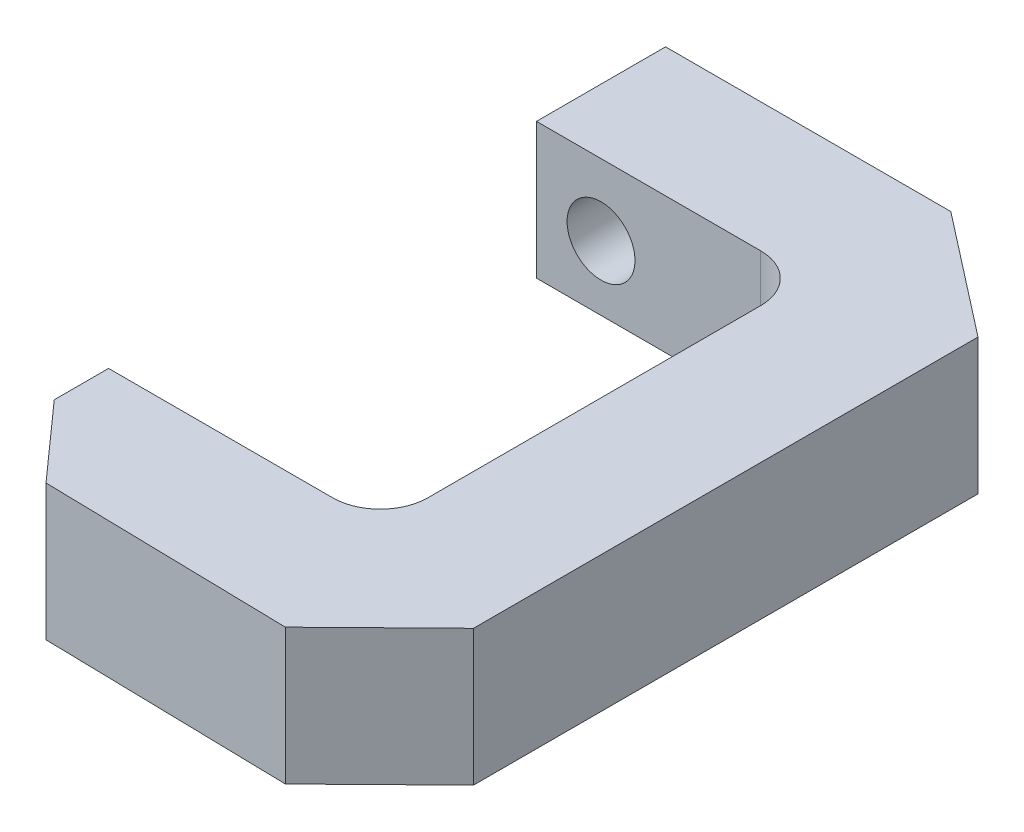
ISO-10303-21;
HEADER;
FILE_DESCRIPTION(('STEP AP214'),'2;1');
FILE_NAME('part.step','',(''),(''),'','','');
FILE_SCHEMA(('AUTOMOTIVE_DESIGN { 1 0 10303 214 1 1 1 1 }'));
ENDSEC;
DATA;
#1=APPLICATION_CONTEXT('core data for automotive mechanical design processes');
#2=APPLICATION_PROTOCOL_DEFINITION('international standard','automotive_design',2000,#1);
#3=PRODUCT_CONTEXT('',#1,'mechanical');
#4=PRODUCT('Part','Part','',(#3));
#5=PRODUCT_RELATED_PRODUCT_CATEGORY('part','',(#4));
#6=PRODUCT_DEFINITION_FORMATION('','',#4);
#7=PRODUCT_DEFINITION_CONTEXT('part definition',#1,'design');
#8=PRODUCT_DEFINITION('design','',#6,#7);
#9=PRODUCT_DEFINITION_SHAPE('','',#8);
#10=(LENGTH_UNIT() NAMED_UNIT(*) SI_UNIT(.MILLI.,.METRE.));
#11=(NAMED_UNIT(*) PLANE_ANGLE_UNIT() SI_UNIT($,.RADIAN.));
#12=(NAMED_UNIT(*) SI_UNIT($,.STERADIAN.) SOLID_ANGLE_UNIT());
#13=UNCERTAINTY_MEASURE_WITH_UNIT(LENGTH_MEASURE(1.E-05),#10,'distance_accuracy_value','');
#14=(GEOMETRIC_REPRESENTATION_CONTEXT(3) GLOBAL_UNCERTAINTY_ASSIGNED_CONTEXT((#13)) GLOBAL_UNIT_ASSIGNED_CONTEXT((#10,
#11,#12)) REPRESENTATION_CONTEXT('',''));
#15=CARTESIAN_POINT('',(0.,0.,0.));
#16=DIRECTION('',(0.,0.,1.));
#17=DIRECTION('',(1.,0.,0.));
#18=AXIS2_PLACEMENT_3D('',#15,#16,#17);
#19=CARTESIAN_POINT('',(33.,0.,-26.));
#20=DIRECTION('',(0.,-1.,0.));
#21=DIRECTION('',(0.,0.,-1.));
#22=AXIS2_PLACEMENT_3D('',#19,#20,#21);
#23=CYLINDRICAL_SURFACE('',#22,7.);
#24=DIRECTION('',(0.,1.,0.));
#25=VECTOR('',#24,1.);
#26=CARTESIAN_POINT('',(40.,0.,-26.));
#27=LINE('',#26,#25);
#28=CARTESIAN_POINT('',(40.,0.,-26.));
#29=VERTEX_POINT('',#28);
#30=CARTESIAN_POINT('',(40.,20.,-26.));
#31=VERTEX_POINT('',#30);
#32=EDGE_CURVE('E181',#29,#31,#27,.T.);
#33=ORIENTED_EDGE('',*,*,#32,.F.);
#34=CARTESIAN_POINT('',(33.,0.,-26.));
#35=DIRECTION('',(0.,-1.,0.));
#36=DIRECTION('',(0.,0.,-1.));
#37=AXIS2_PLACEMENT_3D('',#34,#35,#36);
#38=CIRCLE('',#37,7.);
#39=CARTESIAN_POINT('',(33.,0.,-19.));
#40=VERTEX_POINT('',#39);
#41=EDGE_CURVE('E44',#29,#40,#38,.T.);
#42=ORIENTED_EDGE('',*,*,#41,.T.);
#43=DIRECTION('',(0.,1.,0.));
#44=VECTOR('',#43,1.);
#45=CARTESIAN_POINT('',(33.,0.,-19.));
#46=LINE('',#45,#44);
#47=CARTESIAN_POINT('',(33.,20.,-19.));
#48=VERTEX_POINT('',#47);
#49=EDGE_CURVE('E133',#48,#40,#46,.F.);
#50=ORIENTED_EDGE('',*,*,#49,.F.);
#51=CARTESIAN_POINT('',(33.,20.,-26.));
#52=DIRECTION('',(0.,-1.,0.));
#53=DIRECTION('',(0.,0.,-1.));
#54=AXIS2_PLACEMENT_3D('',#51,#52,#53);
#55=CIRCLE('',#54,7.);
#56=EDGE_CURVE('E11',#48,#31,#55,.F.);
#57=ORIENTED_EDGE('',*,*,#56,.T.);
#58=EDGE_LOOP('',(#33,#42,#50,#57));
#59=FACE_BOUND('',#58,.T.);
#60=ADVANCED_FACE('F37',(#59),#23,.F.);
#61=CARTESIAN_POINT('',(33.,0.,-75.));
#62=DIRECTION('',(0.,-1.,0.));
#63=DIRECTION('',(0.,0.,-1.));
#64=AXIS2_PLACEMENT_3D('',#61,#62,#63);
#65=CYLINDRICAL_SURFACE('',#64,7.);
#66=DIRECTION('',(0.,1.,0.));
#67=VECTOR('',#66,1.);
#68=CARTESIAN_POINT('',(33.,0.,-82.));
#69=LINE('',#68,#67);
#70=CARTESIAN_POINT('',(33.,0.,-82.));
#71=VERTEX_POINT('',#70);
#72=CARTESIAN_POINT('',(33.,20.,-82.));
#73=VERTEX_POINT('',#72);
#74=EDGE_CURVE('E164',#71,#73,#69,.T.);
#75=ORIENTED_EDGE('',*,*,#74,.F.);
#76=CARTESIAN_POINT('',(33.,0.,-75.));
#77=DIRECTION('',(0.,-1.,0.));
#78=DIRECTION('',(0.,0.,-1.));
#79=AXIS2_PLACEMENT_3D('',#76,#77,#78);
#80=CIRCLE('',#79,7.);
#81=CARTESIAN_POINT('',(40.,0.,-75.));
#82=VERTEX_POINT('',#81);
#83=EDGE_CURVE('E176',#71,#82,#80,.T.);
#84=ORIENTED_EDGE('',*,*,#83,.T.);
#85=DIRECTION('',(0.,1.,0.));
#86=VECTOR('',#85,1.);
#87=CARTESIAN_POINT('',(40.,0.,-75.));
#88=LINE('',#87,#86);
#89=CARTESIAN_POINT('',(40.,20.,-75.));
#90=VERTEX_POINT('',#89);
#91=EDGE_CURVE('E173',#90,#82,#88,.F.);
#92=ORIENTED_EDGE('',*,*,#91,.F.);
#93=CARTESIAN_POINT('',(33.,20.,-75.));
#94=DIRECTION('',(0.,-1.,0.));
#95=DIRECTION('',(0.,0.,-1.));
#96=AXIS2_PLACEMENT_3D('',#93,#94,#95);
#97=CIRCLE('',#96,7.);
#98=EDGE_CURVE('E179',#90,#73,#97,.F.);
#99=ORIENTED_EDGE('',*,*,#98,.T.);
#100=EDGE_LOOP('',(#75,#84,#92,#99));
#101=FACE_BOUND('',#100,.T.);
#102=ADVANCED_FACE('F282',(#101),#65,.F.);
#103=CARTESIAN_POINT('',(0.,20.,0.));
#104=DIRECTION('',(1.,0.,0.));
#105=DIRECTION('',(0.,0.,-1.));
#106=AXIS2_PLACEMENT_3D('',#103,#104,#105);
#107=PLANE('',#106);
#108=DIRECTION('',(0.,0.,1.));
#109=VECTOR('',#108,1.);
#110=CARTESIAN_POINT('',(0.,0.,0.));
#111=LINE('',#110,#109);
#112=CARTESIAN_POINT('',(0.,0.,-101.));
#113=VERTEX_POINT('',#112);
#114=CARTESIAN_POINT('',(0.,0.,-82.));
#115=VERTEX_POINT('',#114);
#116=EDGE_CURVE('E152',#113,#115,#111,.T.);
#117=ORIENTED_EDGE('',*,*,#116,.T.);
#118=DIRECTION('',(0.,1.,0.));
#119=VECTOR('',#118,1.);
#120=CARTESIAN_POINT('',(0.,0.,-82.));
#121=LINE('',#120,#119);
#122=CARTESIAN_POINT('',(0.,20.,-82.));
#123=VERTEX_POINT('',#122);
#124=EDGE_CURVE('E146',#115,#123,#121,.T.);
#125=ORIENTED_EDGE('',*,*,#124,.T.);
#126=DIRECTION('',(0.,0.,1.));
#127=VECTOR('',#126,1.);
#128=CARTESIAN_POINT('',(0.,20.,0.));
#129=LINE('',#128,#127);
#130=CARTESIAN_POINT('',(0.,20.,-101.));
#131=VERTEX_POINT('',#130);
#132=EDGE_CURVE('E165',#131,#123,#129,.T.);
#133=ORIENTED_EDGE('',*,*,#132,.F.);
#134=DIRECTION('',(0.,-1.,0.));
#135=VECTOR('',#134,1.);
#136=CARTESIAN_POINT('',(0.,20.,-101.));
#137=LINE('',#136,#135);
#138=EDGE_CURVE('E161',#131,#113,#137,.T.);
#139=ORIENTED_EDGE('',*,*,#138,.T.);
#140=EDGE_LOOP('',(#117,#125,#133,#139));
#141=FACE_BOUND('',#140,.T.);
#142=ADVANCED_FACE('F260',(#141),#107,.F.);
#143=CARTESIAN_POINT('',(60.,20.,1.27599611273081));
#144=DIRECTION('',(0.0212617944039578,0.,-0.999773942498365));
#145=DIRECTION('',(-0.999773942498365,0.,-0.0212617944039578));
#146=AXIS2_PLACEMENT_3D('',#143,#144,#145);
#147=PLANE('',#146);
#148=DIRECTION('',(0.999773942498365,0.,0.0212617944039578));
#149=VECTOR('',#148,1.);
#150=CARTESIAN_POINT('',(60.,0.,1.27599611273081));
#151=LINE('',#150,#149);
#152=CARTESIAN_POINT('',(10.,0.,0.212666018788469));
#153=VERTEX_POINT('',#152);
#154=CARTESIAN_POINT('',(46.,0.,0.978263686426952));
#155=VERTEX_POINT('',#154);
#156=EDGE_CURVE('E231',#153,#155,#151,.T.);
#157=ORIENTED_EDGE('',*,*,#156,.T.);
#158=DIRECTION('',(0.,1.,0.));
#159=VECTOR('',#158,1.);
#160=CARTESIAN_POINT('',(46.,0.,0.978263686426953));
#161=LINE('',#160,#159);
#162=CARTESIAN_POINT('',(46.,20.,0.978263686426953));
#163=VERTEX_POINT('',#162);
#164=EDGE_CURVE('E211',#155,#163,#161,.T.);
#165=ORIENTED_EDGE('',*,*,#164,.T.);
#166=DIRECTION('',(0.999773942498365,0.,0.0212617944039578));
#167=VECTOR('',#166,1.);
#168=CARTESIAN_POINT('',(60.,20.,1.27599611273081));
#169=LINE('',#168,#167);
#170=CARTESIAN_POINT('',(10.,20.,0.212666018788469));
#171=VERTEX_POINT('',#170);
#172=EDGE_CURVE('E156',#171,#163,#169,.T.);
#173=ORIENTED_EDGE('',*,*,#172,.F.);
#174=DIRECTION('',(0.,1.,0.));
#175=VECTOR('',#174,1.);
#176=CARTESIAN_POINT('',(10.,0.,0.212666018788469));
#177=LINE('',#176,#175);
#178=EDGE_CURVE('E210',#153,#171,#177,.T.);
#179=ORIENTED_EDGE('',*,*,#178,.F.);
#180=EDGE_LOOP('',(#157,#165,#173,#179));
#181=FACE_BOUND('',#180,.T.);
#182=ADVANCED_FACE('F268',(#181),#147,.F.);
#183=CARTESIAN_POINT('',(60.,20.,-101.));
#184=DIRECTION('',(-1.,0.,0.));
#185=DIRECTION('',(0.,0.,1.));
#186=AXIS2_PLACEMENT_3D('',#183,#184,#185);
#187=PLANE('',#186);
#188=DIRECTION('',(0.,0.,-1.));
#189=VECTOR('',#188,1.);
#190=CARTESIAN_POINT('',(60.,20.,-101.));
#191=LINE('',#190,#189);
#192=CARTESIAN_POINT('',(60.,20.,-12.7240038872692));
#193=VERTEX_POINT('',#192);
#194=CARTESIAN_POINT('',(60.,20.,-87.));
#195=VERTEX_POINT('',#194);
#196=EDGE_CURVE('E235',#193,#195,#191,.T.);
#197=ORIENTED_EDGE('',*,*,#196,.F.);
#198=DIRECTION('',(0.,1.,0.));
#199=VECTOR('',#198,1.);
#200=CARTESIAN_POINT('',(60.,0.,-12.7240038872692));
#201=LINE('',#200,#199);
#202=CARTESIAN_POINT('',(60.,0.,-12.7240038872692));
#203=VERTEX_POINT('',#202);
#204=EDGE_CURVE('E207',#203,#193,#201,.T.);
#205=ORIENTED_EDGE('',*,*,#204,.F.);
#206=DIRECTION('',(0.,0.,-1.));
#207=VECTOR('',#206,1.);
#208=CARTESIAN_POINT('',(60.,0.,-101.));
#209=LINE('',#208,#207);
#210=CARTESIAN_POINT('',(60.,0.,-87.));
#211=VERTEX_POINT('',#210);
#212=EDGE_CURVE('E157',#203,#211,#209,.T.);
#213=ORIENTED_EDGE('',*,*,#212,.T.);
#214=DIRECTION('',(0.,1.,0.));
#215=VECTOR('',#214,1.);
#216=CARTESIAN_POINT('',(60.,0.,-87.));
#217=LINE('',#216,#215);
#218=EDGE_CURVE('E228',#211,#195,#217,.T.);
#219=ORIENTED_EDGE('',*,*,#218,.T.);
#220=EDGE_LOOP('',(#197,#205,#213,#219));
#221=FACE_BOUND('',#220,.T.);
#222=ADVANCED_FACE('F247',(#221),#187,.F.);
#223=CARTESIAN_POINT('',(0.,20.,-101.));
#224=DIRECTION('',(0.,0.,1.));
#225=DIRECTION('',(1.,0.,0.));
#226=AXIS2_PLACEMENT_3D('',#223,#224,#225);
#227=PLANE('',#226);
#228=CARTESIAN_POINT('',(9.5,9.5,-101.));
#229=DIRECTION('',(0.,0.,-1.));
#230=DIRECTION('',(-1.,0.,0.));
#231=AXIS2_PLACEMENT_3D('',#228,#229,#230);
#232=CIRCLE('',#231,5.);
#233=CARTESIAN_POINT('',(4.5,9.5,-101.));
#234=VERTEX_POINT('',#233);
#235=EDGE_CURVE('E170',#234,#234,#232,.T.);
#236=ORIENTED_EDGE('',*,*,#235,.F.);
#237=EDGE_LOOP('',(#236));
#238=FACE_BOUND('',#237,.T.);
#239=DIRECTION('',(-1.,0.,0.));
#240=VECTOR('',#239,1.);
#241=CARTESIAN_POINT('',(0.,20.,-101.));
#242=LINE('',#241,#240);
#243=CARTESIAN_POINT('',(42.,20.,-101.));
#244=VERTEX_POINT('',#243);
#245=EDGE_CURVE('E237',#244,#131,#242,.T.);
#246=ORIENTED_EDGE('',*,*,#245,.F.);
#247=DIRECTION('',(0.,1.,0.));
#248=VECTOR('',#247,1.);
#249=CARTESIAN_POINT('',(42.,0.,-101.));
#250=LINE('',#249,#248);
#251=CARTESIAN_POINT('',(42.,0.,-101.));
#252=VERTEX_POINT('',#251);
#253=EDGE_CURVE('E225',#252,#244,#250,.T.);
#254=ORIENTED_EDGE('',*,*,#253,.F.);
#255=DIRECTION('',(-1.,0.,0.));
#256=VECTOR('',#255,1.);
#257=CARTESIAN_POINT('',(0.,0.,-101.));
#258=LINE('',#257,#256);
#259=EDGE_CURVE('E153',#252,#113,#258,.T.);
#260=ORIENTED_EDGE('',*,*,#259,.T.);
#261=ORIENTED_EDGE('',*,*,#138,.F.);
#262=EDGE_LOOP('',(#246,#254,#260,#261));
#263=FACE_BOUND('',#262,.T.);
#264=ADVANCED_FACE('F257',(#238,#263),#227,.F.);
#265=CARTESIAN_POINT('',(0.,20.,-19.));
#266=VERTEX_POINT('',#265);
#267=CARTESIAN_POINT('',(0.,20.,-11.));
#268=VERTEX_POINT('',#267);
#269=EDGE_CURVE('E145',#266,#268,#129,.T.);
#270=ORIENTED_EDGE('',*,*,#269,.F.);
#271=DIRECTION('',(0.,1.,0.));
#272=VECTOR('',#271,1.);
#273=CARTESIAN_POINT('',(0.,0.,-19.));
#274=LINE('',#273,#272);
#275=CARTESIAN_POINT('',(0.,0.,-19.));
#276=VERTEX_POINT('',#275);
#277=EDGE_CURVE('E132',#276,#266,#274,.T.);
#278=ORIENTED_EDGE('',*,*,#277,.F.);
#279=CARTESIAN_POINT('',(0.,0.,-11.));
#280=VERTEX_POINT('',#279);
#281=EDGE_CURVE('E143',#276,#280,#111,.T.);
#282=ORIENTED_EDGE('',*,*,#281,.T.);
#283=DIRECTION('',(0.,1.,0.));
#284=VECTOR('',#283,1.);
#285=CARTESIAN_POINT('',(0.,0.,-11.));
#286=LINE('',#285,#284);
#287=EDGE_CURVE('E217',#280,#268,#286,.T.);
#288=ORIENTED_EDGE('',*,*,#287,.T.);
#289=EDGE_LOOP('',(#270,#278,#282,#288));
#290=FACE_BOUND('',#289,.T.);
#291=ADVANCED_FACE('F141',(#290),#107,.F.);
#292=CARTESIAN_POINT('',(0.,20.,0.));
#293=DIRECTION('',(0.,-1.,0.));
#294=DIRECTION('',(0.,0.,-1.));
#295=AXIS2_PLACEMENT_3D('',#292,#293,#294);
#296=PLANE('',#295);
#297=DIRECTION('',(-1.,0.,0.));
#298=VECTOR('',#297,1.);
#299=CARTESIAN_POINT('',(0.,20.,-82.));
#300=LINE('',#299,#298);
#301=EDGE_CURVE('E137',#73,#123,#300,.T.);
#302=ORIENTED_EDGE('',*,*,#301,.F.);
#303=ORIENTED_EDGE('',*,*,#98,.F.);
#304=DIRECTION('',(0.,0.,-1.));
#305=VECTOR('',#304,1.);
#306=CARTESIAN_POINT('',(40.,20.,-82.));
#307=LINE('',#306,#305);
#308=EDGE_CURVE('E187',#31,#90,#307,.T.);
#309=ORIENTED_EDGE('',*,*,#308,.F.);
#310=ORIENTED_EDGE('',*,*,#56,.F.);
#311=DIRECTION('',(1.,0.,0.));
#312=VECTOR('',#311,1.);
#313=CARTESIAN_POINT('',(36.5,20.,-19.));
#314=LINE('',#313,#312);
#315=EDGE_CURVE('E169',#266,#48,#314,.T.);
#316=ORIENTED_EDGE('',*,*,#315,.F.);
#317=ORIENTED_EDGE('',*,*,#269,.T.);
#318=DIRECTION('',(-0.665596833706554,0.,-0.746311499951468));
#319=VECTOR('',#318,1.);
#320=CARTESIAN_POINT('',(0.,20.,-11.));
#321=LINE('',#320,#319);
#322=EDGE_CURVE('E202',#171,#268,#321,.T.);
#323=ORIENTED_EDGE('',*,*,#322,.F.);
#324=ORIENTED_EDGE('',*,*,#172,.T.);
#325=DIRECTION('',(-0.714665195675868,0.,0.699466695482761));
#326=VECTOR('',#325,1.);
#327=CARTESIAN_POINT('',(46.,20.,0.978263686426953));
#328=LINE('',#327,#326);
#329=EDGE_CURVE('E208',#193,#163,#328,.T.);
#330=ORIENTED_EDGE('',*,*,#329,.F.);
#331=ORIENTED_EDGE('',*,*,#196,.T.);
#332=DIRECTION('',(0.789352217376327,0.,0.61394061351492));
#333=VECTOR('',#332,1.);
#334=CARTESIAN_POINT('',(42.,20.,-101.));
#335=LINE('',#334,#333);
#336=EDGE_CURVE('E214',#244,#195,#335,.T.);
#337=ORIENTED_EDGE('',*,*,#336,.F.);
#338=ORIENTED_EDGE('',*,*,#245,.T.);
#339=ORIENTED_EDGE('',*,*,#132,.T.);
#340=EDGE_LOOP('',(#302,#303,#309,#310,#316,#317,#323,#324,#330,#331,#337,#338,#339));
#341=FACE_BOUND('',#340,.T.);
#342=ADVANCED_FACE('F191',(#341),#296,.F.);
#343=CARTESIAN_POINT('',(0.,0.,0.));
#344=DIRECTION('',(0.,-1.,0.));
#345=DIRECTION('',(0.,0.,-1.));
#346=AXIS2_PLACEMENT_3D('',#343,#344,#345);
#347=PLANE('',#346);
#348=ORIENTED_EDGE('',*,*,#41,.F.);
#349=DIRECTION('',(0.,0.,-1.));
#350=VECTOR('',#349,1.);
#351=CARTESIAN_POINT('',(40.,0.,-82.));
#352=LINE('',#351,#350);
#353=EDGE_CURVE('E189',#29,#82,#352,.T.);
#354=ORIENTED_EDGE('',*,*,#353,.T.);
#355=ORIENTED_EDGE('',*,*,#83,.F.);
#356=DIRECTION('',(-1.,0.,0.));
#357=VECTOR('',#356,1.);
#358=CARTESIAN_POINT('',(0.,0.,-82.));
#359=LINE('',#358,#357);
#360=EDGE_CURVE('E136',#71,#115,#359,.T.);
#361=ORIENTED_EDGE('',*,*,#360,.T.);
#362=ORIENTED_EDGE('',*,*,#116,.F.);
#363=ORIENTED_EDGE('',*,*,#259,.F.);
#364=DIRECTION('',(0.789352217376327,0.,0.61394061351492));
#365=VECTOR('',#364,1.);
#366=CARTESIAN_POINT('',(42.,0.,-101.));
#367=LINE('',#366,#365);
#368=EDGE_CURVE('E222',#252,#211,#367,.T.);
#369=ORIENTED_EDGE('',*,*,#368,.T.);
#370=ORIENTED_EDGE('',*,*,#212,.F.);
#371=DIRECTION('',(-0.714665195675868,0.,0.699466695482761));
#372=VECTOR('',#371,1.);
#373=CARTESIAN_POINT('',(46.,0.,0.978263686426953));
#374=LINE('',#373,#372);
#375=EDGE_CURVE('E204',#203,#155,#374,.T.);
#376=ORIENTED_EDGE('',*,*,#375,.T.);
#377=ORIENTED_EDGE('',*,*,#156,.F.);
#378=DIRECTION('',(-0.665596833706554,0.,-0.746311499951468));
#379=VECTOR('',#378,1.);
#380=CARTESIAN_POINT('',(0.,0.,-11.));
#381=LINE('',#380,#379);
#382=EDGE_CURVE('E151',#153,#280,#381,.T.);
#383=ORIENTED_EDGE('',*,*,#382,.T.);
#384=ORIENTED_EDGE('',*,*,#281,.F.);
#385=DIRECTION('',(1.,0.,0.));
#386=VECTOR('',#385,1.);
#387=CARTESIAN_POINT('',(36.5,0.,-19.));
#388=LINE('',#387,#386);
#389=EDGE_CURVE('E128',#276,#40,#388,.T.);
#390=ORIENTED_EDGE('',*,*,#389,.T.);
#391=EDGE_LOOP('',(#348,#354,#355,#361,#362,#363,#369,#370,#376,#377,#383,#384,#390));
#392=FACE_BOUND('',#391,.T.);
#393=ADVANCED_FACE('F149',(#392),#347,.T.);
#394=CARTESIAN_POINT('',(42.,0.,-101.));
#395=DIRECTION('',(-0.61394061351492,0.,0.789352217376327));
#396=DIRECTION('',(0.789352217376327,0.,0.61394061351492));
#397=AXIS2_PLACEMENT_3D('',#394,#395,#396);
#398=PLANE('',#397);
#399=ORIENTED_EDGE('',*,*,#336,.T.);
#400=ORIENTED_EDGE('',*,*,#218,.F.);
#401=ORIENTED_EDGE('',*,*,#368,.F.);
#402=ORIENTED_EDGE('',*,*,#253,.T.);
#403=EDGE_LOOP('',(#399,#400,#401,#402));
#404=FACE_BOUND('',#403,.T.);
#405=ADVANCED_FACE('F249',(#404),#398,.F.);
#406=CARTESIAN_POINT('',(0.,0.,-11.));
#407=DIRECTION('',(0.746311499951468,0.,-0.665596833706554));
#408=DIRECTION('',(-0.665596833706554,0.,-0.746311499951468));
#409=AXIS2_PLACEMENT_3D('',#406,#407,#408);
#410=PLANE('',#409);
#411=ORIENTED_EDGE('',*,*,#322,.T.);
#412=ORIENTED_EDGE('',*,*,#287,.F.);
#413=ORIENTED_EDGE('',*,*,#382,.F.);
#414=ORIENTED_EDGE('',*,*,#178,.T.);
#415=EDGE_LOOP('',(#411,#412,#413,#414));
#416=FACE_BOUND('',#415,.T.);
#417=ADVANCED_FACE('F271',(#416),#410,.F.);
#418=CARTESIAN_POINT('',(46.,0.,0.978263686426953));
#419=DIRECTION('',(-0.699466695482761,0.,-0.714665195675868));
#420=DIRECTION('',(-0.714665195675868,0.,0.699466695482761));
#421=AXIS2_PLACEMENT_3D('',#418,#419,#420);
#422=PLANE('',#421);
#423=ORIENTED_EDGE('',*,*,#329,.T.);
#424=ORIENTED_EDGE('',*,*,#164,.F.);
#425=ORIENTED_EDGE('',*,*,#375,.F.);
#426=ORIENTED_EDGE('',*,*,#204,.T.);
#427=EDGE_LOOP('',(#423,#424,#425,#426));
#428=FACE_BOUND('',#427,.T.);
#429=ADVANCED_FACE('F266',(#428),#422,.F.);
#430=CARTESIAN_POINT('',(0.,0.,-82.));
#431=DIRECTION('',(0.,0.,-1.));
#432=DIRECTION('',(-1.,0.,0.));
#433=AXIS2_PLACEMENT_3D('',#430,#431,#432);
#434=PLANE('',#433);
#435=CARTESIAN_POINT('',(9.5,9.5,-82.));
#436=DIRECTION('',(0.,0.,-1.));
#437=DIRECTION('',(-1.,0.,0.));
#438=AXIS2_PLACEMENT_3D('',#435,#436,#437);
#439=CIRCLE('',#438,5.);
#440=CARTESIAN_POINT('',(4.5,9.5,-82.));
#441=VERTEX_POINT('',#440);
#442=EDGE_CURVE('E166',#441,#441,#439,.T.);
#443=ORIENTED_EDGE('',*,*,#442,.T.);
#444=EDGE_LOOP('',(#443));
#445=FACE_BOUND('',#444,.T.);
#446=ORIENTED_EDGE('',*,*,#360,.F.);
#447=ORIENTED_EDGE('',*,*,#74,.T.);
#448=ORIENTED_EDGE('',*,*,#301,.T.);
#449=ORIENTED_EDGE('',*,*,#124,.F.);
#450=EDGE_LOOP('',(#446,#447,#448,#449));
#451=FACE_BOUND('',#450,.T.);
#452=ADVANCED_FACE('F278',(#445,#451),#434,.F.);
#453=CARTESIAN_POINT('',(36.5,0.,-19.));
#454=DIRECTION('',(0.,0.,1.));
#455=DIRECTION('',(1.,0.,0.));
#456=AXIS2_PLACEMENT_3D('',#453,#454,#455);
#457=PLANE('',#456);
#458=ORIENTED_EDGE('',*,*,#315,.T.);
#459=ORIENTED_EDGE('',*,*,#49,.T.);
#460=ORIENTED_EDGE('',*,*,#389,.F.);
#461=ORIENTED_EDGE('',*,*,#277,.T.);
#462=EDGE_LOOP('',(#458,#459,#460,#461));
#463=FACE_BOUND('',#462,.T.);
#464=ADVANCED_FACE('F131',(#463),#457,.F.);
#465=CARTESIAN_POINT('',(9.5,9.5,-81.));
#466=DIRECTION('',(0.,0.,-1.));
#467=DIRECTION('',(-1.,0.,0.));
#468=AXIS2_PLACEMENT_3D('',#465,#466,#467);
#469=CYLINDRICAL_SURFACE('',#468,5.);
#470=ORIENTED_EDGE('',*,*,#235,.T.);
#471=EDGE_LOOP('',(#470));
#472=FACE_BOUND('',#471,.T.);
#473=ORIENTED_EDGE('',*,*,#442,.F.);
#474=EDGE_LOOP('',(#473));
#475=FACE_BOUND('',#474,.T.);
#476=ADVANCED_FACE('F362',(#472,#475),#469,.F.);
#477=CARTESIAN_POINT('',(40.,0.,-82.));
#478=DIRECTION('',(1.,0.,0.));
#479=DIRECTION('',(0.,0.,-1.));
#480=AXIS2_PLACEMENT_3D('',#477,#478,#479);
#481=PLANE('',#480);
#482=ORIENTED_EDGE('',*,*,#353,.F.);
#483=ORIENTED_EDGE('',*,*,#32,.T.);
#484=ORIENTED_EDGE('',*,*,#308,.T.);
#485=ORIENTED_EDGE('',*,*,#91,.T.);
#486=EDGE_LOOP('',(#482,#483,#484,#485));
#487=FACE_BOUND('',#486,.T.);
#488=ADVANCED_FACE('F186',(#487),#481,.F.);
#489=CLOSED_SHELL('',(#60,#102,#142,#182,#222,#264,#291,#342,#393,#405,#417,#429,#452,#464,#476,#488));
#490=MANIFOLD_SOLID_BREP('B2',#489);
#491=ADVANCED_BREP_SHAPE_REPRESENTATION('',(#18,#490),#14);
#492=SHAPE_DEFINITION_REPRESENTATION(#9,#491);
ENDSEC;
END-ISO-10303-21;
